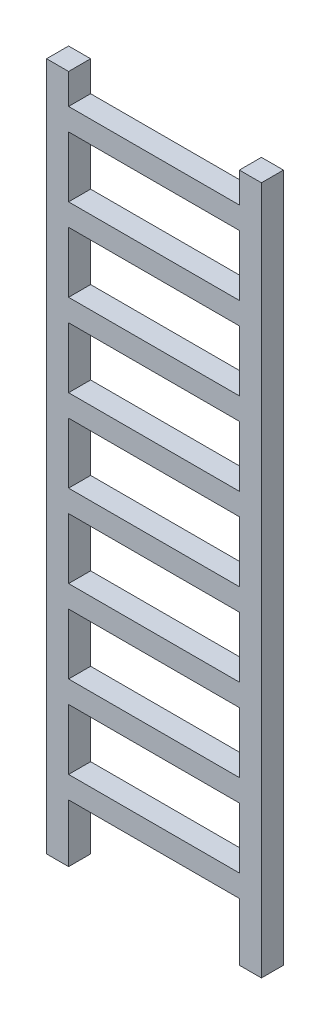
ISO-10303-21;
HEADER;
FILE_DESCRIPTION(('STEP AP214'),'2;1');
FILE_NAME('part.step','',(''),(''),'','','');
FILE_SCHEMA(('AUTOMOTIVE_DESIGN { 1 0 10303 214 1 1 1 1 }'));
ENDSEC;
DATA;
#1=APPLICATION_CONTEXT('core data for automotive mechanical design processes');
#2=APPLICATION_PROTOCOL_DEFINITION('international standard','automotive_design',2000,#1);
#3=PRODUCT_CONTEXT('',#1,'mechanical');
#4=PRODUCT('Part','Part','',(#3));
#5=PRODUCT_RELATED_PRODUCT_CATEGORY('part','',(#4));
#6=PRODUCT_DEFINITION_FORMATION('','',#4);
#7=PRODUCT_DEFINITION_CONTEXT('part definition',#1,'design');
#8=PRODUCT_DEFINITION('design','',#6,#7);
#9=PRODUCT_DEFINITION_SHAPE('','',#8);
#10=(LENGTH_UNIT() NAMED_UNIT(*) SI_UNIT(.MILLI.,.METRE.));
#11=(NAMED_UNIT(*) PLANE_ANGLE_UNIT() SI_UNIT($,.RADIAN.));
#12=(NAMED_UNIT(*) SI_UNIT($,.STERADIAN.) SOLID_ANGLE_UNIT());
#13=UNCERTAINTY_MEASURE_WITH_UNIT(LENGTH_MEASURE(1.E-05),#10,'distance_accuracy_value','');
#14=(GEOMETRIC_REPRESENTATION_CONTEXT(3) GLOBAL_UNCERTAINTY_ASSIGNED_CONTEXT((#13)) GLOBAL_UNIT_ASSIGNED_CONTEXT((#10,
#11,#12)) REPRESENTATION_CONTEXT('',''));
#15=CARTESIAN_POINT('',(0.,0.,0.));
#16=DIRECTION('',(0.,0.,1.));
#17=DIRECTION('',(1.,0.,0.));
#18=AXIS2_PLACEMENT_3D('',#15,#16,#17);
#19=CARTESIAN_POINT('',(-310.,-1250.,80.));
#20=DIRECTION('',(-1.,0.,0.));
#21=DIRECTION('',(0.,0.,1.));
#22=AXIS2_PLACEMENT_3D('',#19,#20,#21);
#23=PLANE('',#22);
#24=DIRECTION('',(0.,0.,1.));
#25=VECTOR('',#24,1.);
#26=CARTESIAN_POINT('',(-310.,-960.,80.));
#27=LINE('',#26,#25);
#28=CARTESIAN_POINT('',(-310.,-960.,0.));
#29=VERTEX_POINT('',#28);
#30=CARTESIAN_POINT('',(-310.,-960.,80.));
#31=VERTEX_POINT('',#30);
#32=EDGE_CURVE('E333',#29,#31,#27,.T.);
#33=ORIENTED_EDGE('',*,*,#32,.F.);
#34=DIRECTION('',(0.,1.,0.));
#35=VECTOR('',#34,1.);
#36=CARTESIAN_POINT('',(-310.,-1250.,0.));
#37=LINE('',#36,#35);
#38=CARTESIAN_POINT('',(-310.,-740.,0.));
#39=VERTEX_POINT('',#38);
#40=EDGE_CURVE('E537',#29,#39,#37,.T.);
#41=ORIENTED_EDGE('',*,*,#40,.T.);
#42=DIRECTION('',(0.,0.,-1.));
#43=VECTOR('',#42,1.);
#44=CARTESIAN_POINT('',(-310.,-740.,80.));
#45=LINE('',#44,#43);
#46=CARTESIAN_POINT('',(-310.,-740.,80.));
#47=VERTEX_POINT('',#46);
#48=EDGE_CURVE('E351',#47,#39,#45,.T.);
#49=ORIENTED_EDGE('',*,*,#48,.F.);
#50=DIRECTION('',(0.,1.,0.));
#51=VECTOR('',#50,1.);
#52=CARTESIAN_POINT('',(-310.,-1250.,80.));
#53=LINE('',#52,#51);
#54=EDGE_CURVE('E526',#31,#47,#53,.T.);
#55=ORIENTED_EDGE('',*,*,#54,.F.);
#56=EDGE_LOOP('',(#33,#41,#49,#55));
#57=FACE_BOUND('',#56,.T.);
#58=ADVANCED_FACE('F41',(#57),#23,.F.);
#59=DIRECTION('',(0.,0.,-1.));
#60=VECTOR('',#59,1.);
#61=CARTESIAN_POINT('',(-310.,-1040.,80.));
#62=LINE('',#61,#60);
#63=CARTESIAN_POINT('',(-310.,-1040.,80.));
#64=VERTEX_POINT('',#63);
#65=CARTESIAN_POINT('',(-310.,-1040.,0.));
#66=VERTEX_POINT('',#65);
#67=EDGE_CURVE('E317',#64,#66,#62,.T.);
#68=ORIENTED_EDGE('',*,*,#67,.F.);
#69=CARTESIAN_POINT('',(-310.,-1250.,80.));
#70=VERTEX_POINT('',#69);
#71=EDGE_CURVE('E522',#70,#64,#53,.T.);
#72=ORIENTED_EDGE('',*,*,#71,.F.);
#73=DIRECTION('',(0.,0.,-1.));
#74=VECTOR('',#73,1.);
#75=CARTESIAN_POINT('',(-310.,-1250.,80.));
#76=LINE('',#75,#74);
#77=CARTESIAN_POINT('',(-310.,-1250.,0.));
#78=VERTEX_POINT('',#77);
#79=EDGE_CURVE('E533',#70,#78,#76,.T.);
#80=ORIENTED_EDGE('',*,*,#79,.T.);
#81=EDGE_CURVE('E534',#78,#66,#37,.T.);
#82=ORIENTED_EDGE('',*,*,#81,.T.);
#83=EDGE_LOOP('',(#68,#72,#80,#82));
#84=FACE_BOUND('',#83,.T.);
#85=ADVANCED_FACE('F724',(#84),#23,.F.);
#86=CARTESIAN_POINT('',(310.,-1250.,80.));
#87=DIRECTION('',(1.,0.,0.));
#88=DIRECTION('',(0.,0.,-1.));
#89=AXIS2_PLACEMENT_3D('',#86,#87,#88);
#90=PLANE('',#89);
#91=DIRECTION('',(0.,0.,-1.));
#92=VECTOR('',#91,1.);
#93=CARTESIAN_POINT('',(310.,-960.,80.));
#94=LINE('',#93,#92);
#95=CARTESIAN_POINT('',(310.,-960.,80.));
#96=VERTEX_POINT('',#95);
#97=CARTESIAN_POINT('',(310.,-960.,0.));
#98=VERTEX_POINT('',#97);
#99=EDGE_CURVE('E64',#96,#98,#94,.T.);
#100=ORIENTED_EDGE('',*,*,#99,.F.);
#101=DIRECTION('',(0.,-1.,0.));
#102=VECTOR('',#101,1.);
#103=CARTESIAN_POINT('',(310.,-1250.,80.));
#104=LINE('',#103,#102);
#105=CARTESIAN_POINT('',(310.,-740.,80.));
#106=VERTEX_POINT('',#105);
#107=EDGE_CURVE('E607',#106,#96,#104,.T.);
#108=ORIENTED_EDGE('',*,*,#107,.F.);
#109=DIRECTION('',(0.,0.,1.));
#110=VECTOR('',#109,1.);
#111=CARTESIAN_POINT('',(310.,-740.,80.));
#112=LINE('',#111,#110);
#113=CARTESIAN_POINT('',(310.,-740.,0.));
#114=VERTEX_POINT('',#113);
#115=EDGE_CURVE('E344',#114,#106,#112,.T.);
#116=ORIENTED_EDGE('',*,*,#115,.F.);
#117=DIRECTION('',(0.,-1.,0.));
#118=VECTOR('',#117,1.);
#119=CARTESIAN_POINT('',(310.,-1250.,0.));
#120=LINE('',#119,#118);
#121=EDGE_CURVE('E308',#114,#98,#120,.T.);
#122=ORIENTED_EDGE('',*,*,#121,.T.);
#123=EDGE_LOOP('',(#100,#108,#116,#122));
#124=FACE_BOUND('',#123,.T.);
#125=ADVANCED_FACE('F594',(#124),#90,.F.);
#126=DIRECTION('',(0.,0.,1.));
#127=VECTOR('',#126,1.);
#128=CARTESIAN_POINT('',(310.,-1040.,80.));
#129=LINE('',#128,#127);
#130=CARTESIAN_POINT('',(310.,-1040.,0.));
#131=VERTEX_POINT('',#130);
#132=CARTESIAN_POINT('',(310.,-1040.,80.));
#133=VERTEX_POINT('',#132);
#134=EDGE_CURVE('E312',#131,#133,#129,.T.);
#135=ORIENTED_EDGE('',*,*,#134,.F.);
#136=CARTESIAN_POINT('',(310.,-1250.,0.));
#137=VERTEX_POINT('',#136);
#138=EDGE_CURVE('E299',#131,#137,#120,.T.);
#139=ORIENTED_EDGE('',*,*,#138,.T.);
#140=DIRECTION('',(0.,0.,-1.));
#141=VECTOR('',#140,1.);
#142=CARTESIAN_POINT('',(310.,-1250.,80.));
#143=LINE('',#142,#141);
#144=CARTESIAN_POINT('',(310.,-1250.,80.));
#145=VERTEX_POINT('',#144);
#146=EDGE_CURVE('E495',#145,#137,#143,.T.);
#147=ORIENTED_EDGE('',*,*,#146,.F.);
#148=EDGE_CURVE('E56',#133,#145,#104,.T.);
#149=ORIENTED_EDGE('',*,*,#148,.F.);
#150=EDGE_LOOP('',(#135,#139,#147,#149));
#151=FACE_BOUND('',#150,.T.);
#152=ADVANCED_FACE('F313',(#151),#90,.F.);
#153=DIRECTION('',(0.,0.,1.));
#154=VECTOR('',#153,1.);
#155=CARTESIAN_POINT('',(-310.,-660.,80.));
#156=LINE('',#155,#154);
#157=CARTESIAN_POINT('',(-310.,-660.,0.));
#158=VERTEX_POINT('',#157);
#159=CARTESIAN_POINT('',(-310.,-660.,80.));
#160=VERTEX_POINT('',#159);
#161=EDGE_CURVE('E357',#158,#160,#156,.T.);
#162=ORIENTED_EDGE('',*,*,#161,.F.);
#163=CARTESIAN_POINT('',(-310.,-440.,0.));
#164=VERTEX_POINT('',#163);
#165=EDGE_CURVE('E604',#158,#164,#37,.T.);
#166=ORIENTED_EDGE('',*,*,#165,.T.);
#167=DIRECTION('',(0.,0.,-1.));
#168=VECTOR('',#167,1.);
#169=CARTESIAN_POINT('',(-310.,-440.,80.));
#170=LINE('',#169,#168);
#171=CARTESIAN_POINT('',(-310.,-440.,80.));
#172=VERTEX_POINT('',#171);
#173=EDGE_CURVE('E375',#172,#164,#170,.T.);
#174=ORIENTED_EDGE('',*,*,#173,.F.);
#175=EDGE_CURVE('E678',#160,#172,#53,.T.);
#176=ORIENTED_EDGE('',*,*,#175,.F.);
#177=EDGE_LOOP('',(#162,#166,#174,#176));
#178=FACE_BOUND('',#177,.T.);
#179=ADVANCED_FACE('F701',(#178),#23,.F.);
#180=DIRECTION('',(0.,0.,-1.));
#181=VECTOR('',#180,1.);
#182=CARTESIAN_POINT('',(310.,-660.,80.));
#183=LINE('',#182,#181);
#184=CARTESIAN_POINT('',(310.,-660.,80.));
#185=VERTEX_POINT('',#184);
#186=CARTESIAN_POINT('',(310.,-660.,0.));
#187=VERTEX_POINT('',#186);
#188=EDGE_CURVE('E354',#185,#187,#183,.T.);
#189=ORIENTED_EDGE('',*,*,#188,.F.);
#190=CARTESIAN_POINT('',(310.,-440.,80.));
#191=VERTEX_POINT('',#190);
#192=EDGE_CURVE('E609',#191,#185,#104,.T.);
#193=ORIENTED_EDGE('',*,*,#192,.F.);
#194=DIRECTION('',(0.,0.,1.));
#195=VECTOR('',#194,1.);
#196=CARTESIAN_POINT('',(310.,-440.,80.));
#197=LINE('',#196,#195);
#198=CARTESIAN_POINT('',(310.,-440.,0.));
#199=VERTEX_POINT('',#198);
#200=EDGE_CURVE('E368',#199,#191,#197,.T.);
#201=ORIENTED_EDGE('',*,*,#200,.F.);
#202=EDGE_CURVE('E588',#199,#187,#120,.T.);
#203=ORIENTED_EDGE('',*,*,#202,.T.);
#204=EDGE_LOOP('',(#189,#193,#201,#203));
#205=FACE_BOUND('',#204,.T.);
#206=ADVANCED_FACE('F708',(#205),#90,.F.);
#207=DIRECTION('',(0.,0.,1.));
#208=VECTOR('',#207,1.);
#209=CARTESIAN_POINT('',(-310.,-360.,80.));
#210=LINE('',#209,#208);
#211=CARTESIAN_POINT('',(-310.,-360.,0.));
#212=VERTEX_POINT('',#211);
#213=CARTESIAN_POINT('',(-310.,-360.,80.));
#214=VERTEX_POINT('',#213);
#215=EDGE_CURVE('E381',#212,#214,#210,.T.);
#216=ORIENTED_EDGE('',*,*,#215,.F.);
#217=CARTESIAN_POINT('',(-310.,-140.,0.));
#218=VERTEX_POINT('',#217);
#219=EDGE_CURVE('E676',#212,#218,#37,.T.);
#220=ORIENTED_EDGE('',*,*,#219,.T.);
#221=DIRECTION('',(0.,0.,-1.));
#222=VECTOR('',#221,1.);
#223=CARTESIAN_POINT('',(-310.,-140.,80.));
#224=LINE('',#223,#222);
#225=CARTESIAN_POINT('',(-310.,-140.,80.));
#226=VERTEX_POINT('',#225);
#227=EDGE_CURVE('E399',#226,#218,#224,.T.);
#228=ORIENTED_EDGE('',*,*,#227,.F.);
#229=EDGE_CURVE('E677',#214,#226,#53,.T.);
#230=ORIENTED_EDGE('',*,*,#229,.F.);
#231=EDGE_LOOP('',(#216,#220,#228,#230));
#232=FACE_BOUND('',#231,.T.);
#233=ADVANCED_FACE('F674',(#232),#23,.F.);
#234=DIRECTION('',(0.,0.,-1.));
#235=VECTOR('',#234,1.);
#236=CARTESIAN_POINT('',(310.,-360.,80.));
#237=LINE('',#236,#235);
#238=CARTESIAN_POINT('',(310.,-360.,80.));
#239=VERTEX_POINT('',#238);
#240=CARTESIAN_POINT('',(310.,-360.,0.));
#241=VERTEX_POINT('',#240);
#242=EDGE_CURVE('E378',#239,#241,#237,.T.);
#243=ORIENTED_EDGE('',*,*,#242,.F.);
#244=CARTESIAN_POINT('',(310.,-140.,80.));
#245=VERTEX_POINT('',#244);
#246=EDGE_CURVE('E611',#245,#239,#104,.T.);
#247=ORIENTED_EDGE('',*,*,#246,.F.);
#248=DIRECTION('',(0.,0.,1.));
#249=VECTOR('',#248,1.);
#250=CARTESIAN_POINT('',(310.,-140.,80.));
#251=LINE('',#250,#249);
#252=CARTESIAN_POINT('',(310.,-140.,0.));
#253=VERTEX_POINT('',#252);
#254=EDGE_CURVE('E392',#253,#245,#251,.T.);
#255=ORIENTED_EDGE('',*,*,#254,.F.);
#256=EDGE_CURVE('E585',#253,#241,#120,.T.);
#257=ORIENTED_EDGE('',*,*,#256,.T.);
#258=EDGE_LOOP('',(#243,#247,#255,#257));
#259=FACE_BOUND('',#258,.T.);
#260=ADVANCED_FACE('F759',(#259),#90,.F.);
#261=DIRECTION('',(0.,0.,1.));
#262=VECTOR('',#261,1.);
#263=CARTESIAN_POINT('',(-310.,-60.0000000000001,80.));
#264=LINE('',#263,#262);
#265=CARTESIAN_POINT('',(-310.,-60.,0.));
#266=VERTEX_POINT('',#265);
#267=CARTESIAN_POINT('',(-310.,-60.0000000000001,80.));
#268=VERTEX_POINT('',#267);
#269=EDGE_CURVE('E405',#266,#268,#264,.T.);
#270=ORIENTED_EDGE('',*,*,#269,.F.);
#271=CARTESIAN_POINT('',(-310.,160.,0.));
#272=VERTEX_POINT('',#271);
#273=EDGE_CURVE('E695',#266,#272,#37,.T.);
#274=ORIENTED_EDGE('',*,*,#273,.T.);
#275=DIRECTION('',(0.,0.,-1.));
#276=VECTOR('',#275,1.);
#277=CARTESIAN_POINT('',(-310.,160.,80.));
#278=LINE('',#277,#276);
#279=CARTESIAN_POINT('',(-310.,160.,80.));
#280=VERTEX_POINT('',#279);
#281=EDGE_CURVE('E423',#280,#272,#278,.T.);
#282=ORIENTED_EDGE('',*,*,#281,.F.);
#283=EDGE_CURVE('E679',#268,#280,#53,.T.);
#284=ORIENTED_EDGE('',*,*,#283,.F.);
#285=EDGE_LOOP('',(#270,#274,#282,#284));
#286=FACE_BOUND('',#285,.T.);
#287=ADVANCED_FACE('F754',(#286),#23,.F.);
#288=DIRECTION('',(0.,0.,-1.));
#289=VECTOR('',#288,1.);
#290=CARTESIAN_POINT('',(310.,-60.0000000000001,80.));
#291=LINE('',#290,#289);
#292=CARTESIAN_POINT('',(310.,-60.0000000000001,80.));
#293=VERTEX_POINT('',#292);
#294=CARTESIAN_POINT('',(310.,-60.0000000000001,0.));
#295=VERTEX_POINT('',#294);
#296=EDGE_CURVE('E402',#293,#295,#291,.T.);
#297=ORIENTED_EDGE('',*,*,#296,.F.);
#298=CARTESIAN_POINT('',(310.,160.,80.));
#299=VERTEX_POINT('',#298);
#300=EDGE_CURVE('E659',#299,#293,#104,.T.);
#301=ORIENTED_EDGE('',*,*,#300,.F.);
#302=DIRECTION('',(0.,0.,1.));
#303=VECTOR('',#302,1.);
#304=CARTESIAN_POINT('',(310.,160.,80.));
#305=LINE('',#304,#303);
#306=CARTESIAN_POINT('',(310.,160.,0.));
#307=VERTEX_POINT('',#306);
#308=EDGE_CURVE('E416',#307,#299,#305,.T.);
#309=ORIENTED_EDGE('',*,*,#308,.F.);
#310=EDGE_CURVE('E582',#307,#295,#120,.T.);
#311=ORIENTED_EDGE('',*,*,#310,.T.);
#312=EDGE_LOOP('',(#297,#301,#309,#311));
#313=FACE_BOUND('',#312,.T.);
#314=ADVANCED_FACE('F752',(#313),#90,.F.);
#315=DIRECTION('',(0.,0.,1.));
#316=VECTOR('',#315,1.);
#317=CARTESIAN_POINT('',(-310.,240.,80.));
#318=LINE('',#317,#316);
#319=CARTESIAN_POINT('',(-310.,240.,0.));
#320=VERTEX_POINT('',#319);
#321=CARTESIAN_POINT('',(-310.,240.,80.));
#322=VERTEX_POINT('',#321);
#323=EDGE_CURVE('E429',#320,#322,#318,.T.);
#324=ORIENTED_EDGE('',*,*,#323,.F.);
#325=CARTESIAN_POINT('',(-310.,460.,0.));
#326=VERTEX_POINT('',#325);
#327=EDGE_CURVE('E686',#320,#326,#37,.T.);
#328=ORIENTED_EDGE('',*,*,#327,.T.);
#329=DIRECTION('',(0.,0.,-1.));
#330=VECTOR('',#329,1.);
#331=CARTESIAN_POINT('',(-310.,460.,80.));
#332=LINE('',#331,#330);
#333=CARTESIAN_POINT('',(-310.,460.,80.));
#334=VERTEX_POINT('',#333);
#335=EDGE_CURVE('E447',#334,#326,#332,.T.);
#336=ORIENTED_EDGE('',*,*,#335,.F.);
#337=EDGE_CURVE('E573',#322,#334,#53,.T.);
#338=ORIENTED_EDGE('',*,*,#337,.F.);
#339=EDGE_LOOP('',(#324,#328,#336,#338));
#340=FACE_BOUND('',#339,.T.);
#341=ADVANCED_FACE('F685',(#340),#23,.F.);
#342=DIRECTION('',(0.,0.,-1.));
#343=VECTOR('',#342,1.);
#344=CARTESIAN_POINT('',(310.,240.,80.));
#345=LINE('',#344,#343);
#346=CARTESIAN_POINT('',(310.,240.,80.));
#347=VERTEX_POINT('',#346);
#348=CARTESIAN_POINT('',(310.,240.,0.));
#349=VERTEX_POINT('',#348);
#350=EDGE_CURVE('E426',#347,#349,#345,.T.);
#351=ORIENTED_EDGE('',*,*,#350,.F.);
#352=CARTESIAN_POINT('',(310.,460.,80.));
#353=VERTEX_POINT('',#352);
#354=EDGE_CURVE('E657',#353,#347,#104,.T.);
#355=ORIENTED_EDGE('',*,*,#354,.F.);
#356=DIRECTION('',(0.,0.,1.));
#357=VECTOR('',#356,1.);
#358=CARTESIAN_POINT('',(310.,460.,80.));
#359=LINE('',#358,#357);
#360=CARTESIAN_POINT('',(310.,460.,0.));
#361=VERTEX_POINT('',#360);
#362=EDGE_CURVE('E440',#361,#353,#359,.T.);
#363=ORIENTED_EDGE('',*,*,#362,.F.);
#364=EDGE_CURVE('E581',#361,#349,#120,.T.);
#365=ORIENTED_EDGE('',*,*,#364,.T.);
#366=EDGE_LOOP('',(#351,#355,#363,#365));
#367=FACE_BOUND('',#366,.T.);
#368=ADVANCED_FACE('F690',(#367),#90,.F.);
#369=DIRECTION('',(0.,0.,1.));
#370=VECTOR('',#369,1.);
#371=CARTESIAN_POINT('',(-310.,540.,80.));
#372=LINE('',#371,#370);
#373=CARTESIAN_POINT('',(-310.,540.,0.));
#374=VERTEX_POINT('',#373);
#375=CARTESIAN_POINT('',(-310.,540.,80.));
#376=VERTEX_POINT('',#375);
#377=EDGE_CURVE('E453',#374,#376,#372,.T.);
#378=ORIENTED_EDGE('',*,*,#377,.F.);
#379=CARTESIAN_POINT('',(-310.,760.,0.));
#380=VERTEX_POINT('',#379);
#381=EDGE_CURVE('E576',#374,#380,#37,.T.);
#382=ORIENTED_EDGE('',*,*,#381,.T.);
#383=DIRECTION('',(0.,0.,-1.));
#384=VECTOR('',#383,1.);
#385=CARTESIAN_POINT('',(-310.,760.,80.));
#386=LINE('',#385,#384);
#387=CARTESIAN_POINT('',(-310.,760.,80.));
#388=VERTEX_POINT('',#387);
#389=EDGE_CURVE('E464',#388,#380,#386,.T.);
#390=ORIENTED_EDGE('',*,*,#389,.F.);
#391=EDGE_CURVE('E569',#376,#388,#53,.T.);
#392=ORIENTED_EDGE('',*,*,#391,.F.);
#393=EDGE_LOOP('',(#378,#382,#390,#392));
#394=FACE_BOUND('',#393,.T.);
#395=ADVANCED_FACE('F575',(#394),#23,.F.);
#396=DIRECTION('',(0.,0.,-1.));
#397=VECTOR('',#396,1.);
#398=CARTESIAN_POINT('',(310.,540.,80.));
#399=LINE('',#398,#397);
#400=CARTESIAN_POINT('',(310.,540.,80.));
#401=VERTEX_POINT('',#400);
#402=CARTESIAN_POINT('',(310.,540.,0.));
#403=VERTEX_POINT('',#402);
#404=EDGE_CURVE('E450',#401,#403,#399,.T.);
#405=ORIENTED_EDGE('',*,*,#404,.F.);
#406=CARTESIAN_POINT('',(310.,760.,80.));
#407=VERTEX_POINT('',#406);
#408=EDGE_CURVE('E567',#407,#401,#104,.T.);
#409=ORIENTED_EDGE('',*,*,#408,.F.);
#410=DIRECTION('',(0.,0.,1.));
#411=VECTOR('',#410,1.);
#412=CARTESIAN_POINT('',(310.,760.,80.));
#413=LINE('',#412,#411);
#414=CARTESIAN_POINT('',(310.,760.,0.));
#415=VERTEX_POINT('',#414);
#416=EDGE_CURVE('E49',#415,#407,#413,.T.);
#417=ORIENTED_EDGE('',*,*,#416,.F.);
#418=EDGE_CURVE('E580',#415,#403,#120,.T.);
#419=ORIENTED_EDGE('',*,*,#418,.T.);
#420=EDGE_LOOP('',(#405,#409,#417,#419));
#421=FACE_BOUND('',#420,.T.);
#422=ADVANCED_FACE('F740',(#421),#90,.F.);
#423=DIRECTION('',(0.,0.,1.));
#424=VECTOR('',#423,1.);
#425=CARTESIAN_POINT('',(-310.,840.,80.));
#426=LINE('',#425,#424);
#427=CARTESIAN_POINT('',(-310.,840.,0.));
#428=VERTEX_POINT('',#427);
#429=CARTESIAN_POINT('',(-310.,840.,80.));
#430=VERTEX_POINT('',#429);
#431=EDGE_CURVE('E471',#428,#430,#426,.T.);
#432=ORIENTED_EDGE('',*,*,#431,.F.);
#433=CARTESIAN_POINT('',(-310.,1060.,0.));
#434=VERTEX_POINT('',#433);
#435=EDGE_CURVE('E637',#428,#434,#37,.T.);
#436=ORIENTED_EDGE('',*,*,#435,.T.);
#437=DIRECTION('',(0.,0.,-1.));
#438=VECTOR('',#437,1.);
#439=CARTESIAN_POINT('',(-310.,1060.,80.));
#440=LINE('',#439,#438);
#441=CARTESIAN_POINT('',(-310.,1060.,80.));
#442=VERTEX_POINT('',#441);
#443=EDGE_CURVE('E513',#442,#434,#440,.T.);
#444=ORIENTED_EDGE('',*,*,#443,.F.);
#445=EDGE_CURVE('E574',#430,#442,#53,.T.);
#446=ORIENTED_EDGE('',*,*,#445,.F.);
#447=EDGE_LOOP('',(#432,#436,#444,#446));
#448=FACE_BOUND('',#447,.T.);
#449=ADVANCED_FACE('F647',(#448),#23,.F.);
#450=DIRECTION('',(0.,0.,-1.));
#451=VECTOR('',#450,1.);
#452=CARTESIAN_POINT('',(310.,840.,80.));
#453=LINE('',#452,#451);
#454=CARTESIAN_POINT('',(310.,840.,80.));
#455=VERTEX_POINT('',#454);
#456=CARTESIAN_POINT('',(310.,840.,0.));
#457=VERTEX_POINT('',#456);
#458=EDGE_CURVE('E11',#455,#457,#453,.T.);
#459=ORIENTED_EDGE('',*,*,#458,.F.);
#460=CARTESIAN_POINT('',(310.,1060.,80.));
#461=VERTEX_POINT('',#460);
#462=EDGE_CURVE('E484',#461,#455,#104,.T.);
#463=ORIENTED_EDGE('',*,*,#462,.F.);
#464=DIRECTION('',(0.,0.,-1.));
#465=VECTOR('',#464,1.);
#466=CARTESIAN_POINT('',(310.,1060.,80.));
#467=LINE('',#466,#465);
#468=CARTESIAN_POINT('',(310.,1060.,0.));
#469=VERTEX_POINT('',#468);
#470=EDGE_CURVE('E554',#461,#469,#467,.T.);
#471=ORIENTED_EDGE('',*,*,#470,.T.);
#472=EDGE_CURVE('E491',#469,#457,#120,.T.);
#473=ORIENTED_EDGE('',*,*,#472,.T.);
#474=EDGE_LOOP('',(#459,#463,#471,#473));
#475=FACE_BOUND('',#474,.T.);
#476=ADVANCED_FACE('F653',(#475),#90,.F.);
#477=CARTESIAN_POINT('',(-350.,1140.,80.));
#478=DIRECTION('',(0.,-1.,0.));
#479=DIRECTION('',(0.,0.,-1.));
#480=AXIS2_PLACEMENT_3D('',#477,#478,#479);
#481=PLANE('',#480);
#482=DIRECTION('',(0.,0.,1.));
#483=VECTOR('',#482,1.);
#484=CARTESIAN_POINT('',(310.,1140.,80.));
#485=LINE('',#484,#483);
#486=CARTESIAN_POINT('',(310.,1140.,0.));
#487=VERTEX_POINT('',#486);
#488=CARTESIAN_POINT('',(310.,1140.,80.));
#489=VERTEX_POINT('',#488);
#490=EDGE_CURVE('E503',#487,#489,#485,.T.);
#491=ORIENTED_EDGE('',*,*,#490,.F.);
#492=DIRECTION('',(-1.,0.,0.));
#493=VECTOR('',#492,1.);
#494=CARTESIAN_POINT('',(-350.,1140.,0.));
#495=LINE('',#494,#493);
#496=CARTESIAN_POINT('',(-310.,1140.,0.));
#497=VERTEX_POINT('',#496);
#498=EDGE_CURVE('E506',#487,#497,#495,.T.);
#499=ORIENTED_EDGE('',*,*,#498,.T.);
#500=DIRECTION('',(0.,0.,1.));
#501=VECTOR('',#500,1.);
#502=CARTESIAN_POINT('',(-310.,1140.,80.));
#503=LINE('',#502,#501);
#504=CARTESIAN_POINT('',(-310.,1140.,80.));
#505=VERTEX_POINT('',#504);
#506=EDGE_CURVE('E518',#497,#505,#503,.T.);
#507=ORIENTED_EDGE('',*,*,#506,.T.);
#508=DIRECTION('',(-1.,0.,0.));
#509=VECTOR('',#508,1.);
#510=CARTESIAN_POINT('',(-350.,1140.,80.));
#511=LINE('',#510,#509);
#512=EDGE_CURVE('E507',#489,#505,#511,.T.);
#513=ORIENTED_EDGE('',*,*,#512,.F.);
#514=EDGE_LOOP('',(#491,#499,#507,#513));
#515=FACE_BOUND('',#514,.T.);
#516=ADVANCED_FACE('F630',(#515),#481,.F.);
#517=CARTESIAN_POINT('',(-350.,1060.,80.));
#518=DIRECTION('',(0.,1.,0.));
#519=DIRECTION('',(0.,0.,1.));
#520=AXIS2_PLACEMENT_3D('',#517,#518,#519);
#521=PLANE('',#520);
#522=ORIENTED_EDGE('',*,*,#470,.F.);
#523=DIRECTION('',(1.,0.,0.));
#524=VECTOR('',#523,1.);
#525=CARTESIAN_POINT('',(-350.,1060.,80.));
#526=LINE('',#525,#524);
#527=EDGE_CURVE('E509',#442,#461,#526,.T.);
#528=ORIENTED_EDGE('',*,*,#527,.F.);
#529=ORIENTED_EDGE('',*,*,#443,.T.);
#530=DIRECTION('',(1.,0.,0.));
#531=VECTOR('',#530,1.);
#532=CARTESIAN_POINT('',(-350.,1060.,0.));
#533=LINE('',#532,#531);
#534=EDGE_CURVE('E510',#434,#469,#533,.T.);
#535=ORIENTED_EDGE('',*,*,#534,.T.);
#536=EDGE_LOOP('',(#522,#528,#529,#535));
#537=FACE_BOUND('',#536,.T.);
#538=ADVANCED_FACE('F650',(#537),#521,.F.);
#539=ORIENTED_EDGE('',*,*,#506,.F.);
#540=CARTESIAN_POINT('',(-310.,1250.,0.));
#541=VERTEX_POINT('',#540);
#542=EDGE_CURVE('E521',#497,#541,#37,.T.);
#543=ORIENTED_EDGE('',*,*,#542,.T.);
#544=DIRECTION('',(0.,0.,-1.));
#545=VECTOR('',#544,1.);
#546=CARTESIAN_POINT('',(-310.,1250.,80.));
#547=LINE('',#546,#545);
#548=CARTESIAN_POINT('',(-310.,1250.,80.));
#549=VERTEX_POINT('',#548);
#550=EDGE_CURVE('E551',#549,#541,#547,.T.);
#551=ORIENTED_EDGE('',*,*,#550,.F.);
#552=EDGE_CURVE('E527',#505,#549,#53,.T.);
#553=ORIENTED_EDGE('',*,*,#552,.F.);
#554=EDGE_LOOP('',(#539,#543,#551,#553));
#555=FACE_BOUND('',#554,.T.);
#556=ADVANCED_FACE('F43',(#555),#23,.F.);
#557=CARTESIAN_POINT('',(-390.,1250.,80.));
#558=DIRECTION('',(0.,-1.,0.));
#559=DIRECTION('',(0.,0.,-1.));
#560=AXIS2_PLACEMENT_3D('',#557,#558,#559);
#561=PLANE('',#560);
#562=DIRECTION('',(-1.,0.,0.));
#563=VECTOR('',#562,1.);
#564=CARTESIAN_POINT('',(-390.,1250.,0.));
#565=LINE('',#564,#563);
#566=CARTESIAN_POINT('',(-390.,1250.,0.));
#567=VERTEX_POINT('',#566);
#568=EDGE_CURVE('E536',#541,#567,#565,.T.);
#569=ORIENTED_EDGE('',*,*,#568,.T.);
#570=DIRECTION('',(0.,0.,-1.));
#571=VECTOR('',#570,1.);
#572=CARTESIAN_POINT('',(-390.,1250.,80.));
#573=LINE('',#572,#571);
#574=CARTESIAN_POINT('',(-390.,1250.,80.));
#575=VERTEX_POINT('',#574);
#576=EDGE_CURVE('E548',#575,#567,#573,.T.);
#577=ORIENTED_EDGE('',*,*,#576,.F.);
#578=DIRECTION('',(-1.,0.,0.));
#579=VECTOR('',#578,1.);
#580=CARTESIAN_POINT('',(-390.,1250.,80.));
#581=LINE('',#580,#579);
#582=EDGE_CURVE('E525',#549,#575,#581,.T.);
#583=ORIENTED_EDGE('',*,*,#582,.F.);
#584=ORIENTED_EDGE('',*,*,#550,.T.);
#585=EDGE_LOOP('',(#569,#577,#583,#584));
#586=FACE_BOUND('',#585,.T.);
#587=ADVANCED_FACE('F730',(#586),#561,.F.);
#588=CARTESIAN_POINT('',(-390.,-1250.,80.));
#589=DIRECTION('',(1.,0.,0.));
#590=DIRECTION('',(0.,0.,-1.));
#591=AXIS2_PLACEMENT_3D('',#588,#589,#590);
#592=PLANE('',#591);
#593=DIRECTION('',(0.,-1.,0.));
#594=VECTOR('',#593,1.);
#595=CARTESIAN_POINT('',(-390.,-1250.,0.));
#596=LINE('',#595,#594);
#597=CARTESIAN_POINT('',(-390.,-1250.,0.));
#598=VERTEX_POINT('',#597);
#599=EDGE_CURVE('E539',#567,#598,#596,.T.);
#600=ORIENTED_EDGE('',*,*,#599,.T.);
#601=DIRECTION('',(0.,0.,-1.));
#602=VECTOR('',#601,1.);
#603=CARTESIAN_POINT('',(-390.,-1250.,80.));
#604=LINE('',#603,#602);
#605=CARTESIAN_POINT('',(-390.,-1250.,80.));
#606=VERTEX_POINT('',#605);
#607=EDGE_CURVE('E545',#606,#598,#604,.T.);
#608=ORIENTED_EDGE('',*,*,#607,.F.);
#609=DIRECTION('',(0.,-1.,0.));
#610=VECTOR('',#609,1.);
#611=CARTESIAN_POINT('',(-390.,-1250.,80.));
#612=LINE('',#611,#610);
#613=EDGE_CURVE('E529',#575,#606,#612,.T.);
#614=ORIENTED_EDGE('',*,*,#613,.F.);
#615=ORIENTED_EDGE('',*,*,#576,.T.);
#616=EDGE_LOOP('',(#600,#608,#614,#615));
#617=FACE_BOUND('',#616,.T.);
#618=ADVANCED_FACE('F736',(#617),#592,.F.);
#619=CARTESIAN_POINT('',(-390.,-1250.,80.));
#620=DIRECTION('',(0.,1.,0.));
#621=DIRECTION('',(0.,0.,1.));
#622=AXIS2_PLACEMENT_3D('',#619,#620,#621);
#623=PLANE('',#622);
#624=DIRECTION('',(1.,0.,0.));
#625=VECTOR('',#624,1.);
#626=CARTESIAN_POINT('',(-390.,-1250.,0.));
#627=LINE('',#626,#625);
#628=EDGE_CURVE('E541',#598,#78,#627,.T.);
#629=ORIENTED_EDGE('',*,*,#628,.T.);
#630=ORIENTED_EDGE('',*,*,#79,.F.);
#631=DIRECTION('',(1.,0.,0.));
#632=VECTOR('',#631,1.);
#633=CARTESIAN_POINT('',(-390.,-1250.,80.));
#634=LINE('',#633,#632);
#635=EDGE_CURVE('E531',#606,#70,#634,.T.);
#636=ORIENTED_EDGE('',*,*,#635,.F.);
#637=ORIENTED_EDGE('',*,*,#607,.T.);
#638=EDGE_LOOP('',(#629,#630,#636,#637));
#639=FACE_BOUND('',#638,.T.);
#640=ADVANCED_FACE('F787',(#639),#623,.F.);
#641=CARTESIAN_POINT('',(0.,0.,80.));
#642=DIRECTION('',(0.,0.,-1.));
#643=DIRECTION('',(-1.,0.,0.));
#644=AXIS2_PLACEMENT_3D('',#641,#642,#643);
#645=PLANE('',#644);
#646=DIRECTION('',(-1.,0.,0.));
#647=VECTOR('',#646,1.);
#648=CARTESIAN_POINT('',(-350.,-960.,80.));
#649=LINE('',#648,#647);
#650=EDGE_CURVE('E322',#96,#31,#649,.T.);
#651=ORIENTED_EDGE('',*,*,#650,.T.);
#652=ORIENTED_EDGE('',*,*,#54,.T.);
#653=DIRECTION('',(1.,0.,0.));
#654=VECTOR('',#653,1.);
#655=CARTESIAN_POINT('',(-350.,-740.,80.));
#656=LINE('',#655,#654);
#657=EDGE_CURVE('E340',#47,#106,#656,.T.);
#658=ORIENTED_EDGE('',*,*,#657,.T.);
#659=ORIENTED_EDGE('',*,*,#107,.T.);
#660=EDGE_LOOP('',(#651,#652,#658,#659));
#661=FACE_BOUND('',#660,.T.);
#662=ORIENTED_EDGE('',*,*,#71,.T.);
#663=DIRECTION('',(1.,0.,0.));
#664=VECTOR('',#663,1.);
#665=CARTESIAN_POINT('',(-350.,-1040.,80.));
#666=LINE('',#665,#664);
#667=EDGE_CURVE('E318',#64,#133,#666,.T.);
#668=ORIENTED_EDGE('',*,*,#667,.T.);
#669=ORIENTED_EDGE('',*,*,#148,.T.);
#670=DIRECTION('',(1.,0.,0.));
#671=VECTOR('',#670,1.);
#672=CARTESIAN_POINT('',(310.,-1250.,80.));
#673=LINE('',#672,#671);
#674=CARTESIAN_POINT('',(390.,-1250.,80.));
#675=VERTEX_POINT('',#674);
#676=EDGE_CURVE('E483',#145,#675,#673,.T.);
#677=ORIENTED_EDGE('',*,*,#676,.T.);
#678=DIRECTION('',(0.,1.,0.));
#679=VECTOR('',#678,1.);
#680=CARTESIAN_POINT('',(390.,-1250.,80.));
#681=LINE('',#680,#679);
#682=CARTESIAN_POINT('',(390.,1250.,80.));
#683=VERTEX_POINT('',#682);
#684=EDGE_CURVE('E475',#675,#683,#681,.T.);
#685=ORIENTED_EDGE('',*,*,#684,.T.);
#686=DIRECTION('',(-1.,0.,0.));
#687=VECTOR('',#686,1.);
#688=CARTESIAN_POINT('',(310.,1250.,80.));
#689=LINE('',#688,#687);
#690=CARTESIAN_POINT('',(310.,1250.,80.));
#691=VERTEX_POINT('',#690);
#692=EDGE_CURVE('E478',#683,#691,#689,.T.);
#693=ORIENTED_EDGE('',*,*,#692,.T.);
#694=EDGE_CURVE('E480',#691,#489,#104,.T.);
#695=ORIENTED_EDGE('',*,*,#694,.T.);
#696=ORIENTED_EDGE('',*,*,#512,.T.);
#697=ORIENTED_EDGE('',*,*,#552,.T.);
#698=ORIENTED_EDGE('',*,*,#582,.T.);
#699=ORIENTED_EDGE('',*,*,#613,.T.);
#700=ORIENTED_EDGE('',*,*,#635,.T.);
#701=EDGE_LOOP('',(#662,#668,#669,#677,#685,#693,#695,#696,#697,#698,#699,#700));
#702=FACE_BOUND('',#701,.T.);
#703=DIRECTION('',(-1.,0.,0.));
#704=VECTOR('',#703,1.);
#705=CARTESIAN_POINT('',(-350.,-660.,80.));
#706=LINE('',#705,#704);
#707=EDGE_CURVE('E337',#185,#160,#706,.T.);
#708=ORIENTED_EDGE('',*,*,#707,.T.);
#709=ORIENTED_EDGE('',*,*,#175,.T.);
#710=DIRECTION('',(1.,0.,0.));
#711=VECTOR('',#710,1.);
#712=CARTESIAN_POINT('',(-350.,-440.,80.));
#713=LINE('',#712,#711);
#714=EDGE_CURVE('E364',#172,#191,#713,.T.);
#715=ORIENTED_EDGE('',*,*,#714,.T.);
#716=ORIENTED_EDGE('',*,*,#192,.T.);
#717=EDGE_LOOP('',(#708,#709,#715,#716));
#718=FACE_BOUND('',#717,.T.);
#719=DIRECTION('',(-1.,0.,0.));
#720=VECTOR('',#719,1.);
#721=CARTESIAN_POINT('',(-350.,-360.,80.));
#722=LINE('',#721,#720);
#723=EDGE_CURVE('E361',#239,#214,#722,.T.);
#724=ORIENTED_EDGE('',*,*,#723,.T.);
#725=ORIENTED_EDGE('',*,*,#229,.T.);
#726=DIRECTION('',(1.,0.,0.));
#727=VECTOR('',#726,1.);
#728=CARTESIAN_POINT('',(-350.,-140.,80.));
#729=LINE('',#728,#727);
#730=EDGE_CURVE('E388',#226,#245,#729,.T.);
#731=ORIENTED_EDGE('',*,*,#730,.T.);
#732=ORIENTED_EDGE('',*,*,#246,.T.);
#733=EDGE_LOOP('',(#724,#725,#731,#732));
#734=FACE_BOUND('',#733,.T.);
#735=DIRECTION('',(-1.,0.,0.));
#736=VECTOR('',#735,1.);
#737=CARTESIAN_POINT('',(-350.,-60.,80.));
#738=LINE('',#737,#736);
#739=EDGE_CURVE('E385',#293,#268,#738,.T.);
#740=ORIENTED_EDGE('',*,*,#739,.T.);
#741=ORIENTED_EDGE('',*,*,#283,.T.);
#742=DIRECTION('',(1.,0.,0.));
#743=VECTOR('',#742,1.);
#744=CARTESIAN_POINT('',(-350.,160.,80.));
#745=LINE('',#744,#743);
#746=EDGE_CURVE('E412',#280,#299,#745,.T.);
#747=ORIENTED_EDGE('',*,*,#746,.T.);
#748=ORIENTED_EDGE('',*,*,#300,.T.);
#749=EDGE_LOOP('',(#740,#741,#747,#748));
#750=FACE_BOUND('',#749,.T.);
#751=DIRECTION('',(-1.,0.,0.));
#752=VECTOR('',#751,1.);
#753=CARTESIAN_POINT('',(-350.,240.,80.));
#754=LINE('',#753,#752);
#755=EDGE_CURVE('E409',#347,#322,#754,.T.);
#756=ORIENTED_EDGE('',*,*,#755,.T.);
#757=ORIENTED_EDGE('',*,*,#337,.T.);
#758=DIRECTION('',(1.,0.,0.));
#759=VECTOR('',#758,1.);
#760=CARTESIAN_POINT('',(-350.,460.,80.));
#761=LINE('',#760,#759);
#762=EDGE_CURVE('E436',#334,#353,#761,.T.);
#763=ORIENTED_EDGE('',*,*,#762,.T.);
#764=ORIENTED_EDGE('',*,*,#354,.T.);
#765=EDGE_LOOP('',(#756,#757,#763,#764));
#766=FACE_BOUND('',#765,.T.);
#767=DIRECTION('',(-1.,0.,0.));
#768=VECTOR('',#767,1.);
#769=CARTESIAN_POINT('',(-350.,540.,80.));
#770=LINE('',#769,#768);
#771=EDGE_CURVE('E433',#401,#376,#770,.T.);
#772=ORIENTED_EDGE('',*,*,#771,.T.);
#773=ORIENTED_EDGE('',*,*,#391,.T.);
#774=DIRECTION('',(1.,0.,0.));
#775=VECTOR('',#774,1.);
#776=CARTESIAN_POINT('',(-350.,760.,80.));
#777=LINE('',#776,#775);
#778=EDGE_CURVE('E460',#388,#407,#777,.T.);
#779=ORIENTED_EDGE('',*,*,#778,.T.);
#780=ORIENTED_EDGE('',*,*,#408,.T.);
#781=EDGE_LOOP('',(#772,#773,#779,#780));
#782=FACE_BOUND('',#781,.T.);
#783=ORIENTED_EDGE('',*,*,#462,.T.);
#784=DIRECTION('',(-1.,0.,0.));
#785=VECTOR('',#784,1.);
#786=CARTESIAN_POINT('',(-350.,840.,80.));
#787=LINE('',#786,#785);
#788=EDGE_CURVE('E457',#455,#430,#787,.T.);
#789=ORIENTED_EDGE('',*,*,#788,.T.);
#790=ORIENTED_EDGE('',*,*,#445,.T.);
#791=ORIENTED_EDGE('',*,*,#527,.T.);
#792=EDGE_LOOP('',(#783,#789,#790,#791));
#793=FACE_BOUND('',#792,.T.);
#794=ADVANCED_FACE('F565',(#661,#702,#718,#734,#750,#766,#782,#793),#645,.F.);
#795=CARTESIAN_POINT('',(0.,0.,0.));
#796=DIRECTION('',(0.,0.,-1.));
#797=DIRECTION('',(-1.,0.,0.));
#798=AXIS2_PLACEMENT_3D('',#795,#796,#797);
#799=PLANE('',#798);
#800=ORIENTED_EDGE('',*,*,#40,.F.);
#801=DIRECTION('',(-1.,0.,0.));
#802=VECTOR('',#801,1.);
#803=CARTESIAN_POINT('',(-350.,-960.,0.));
#804=LINE('',#803,#802);
#805=EDGE_CURVE('E323',#98,#29,#804,.T.);
#806=ORIENTED_EDGE('',*,*,#805,.F.);
#807=ORIENTED_EDGE('',*,*,#121,.F.);
#808=DIRECTION('',(1.,0.,0.));
#809=VECTOR('',#808,1.);
#810=CARTESIAN_POINT('',(-350.,-740.,0.));
#811=LINE('',#810,#809);
#812=EDGE_CURVE('E341',#39,#114,#811,.T.);
#813=ORIENTED_EDGE('',*,*,#812,.F.);
#814=EDGE_LOOP('',(#800,#806,#807,#813));
#815=FACE_BOUND('',#814,.T.);
#816=ORIENTED_EDGE('',*,*,#138,.F.);
#817=DIRECTION('',(1.,0.,0.));
#818=VECTOR('',#817,1.);
#819=CARTESIAN_POINT('',(-350.,-1040.,0.));
#820=LINE('',#819,#818);
#821=EDGE_CURVE('E304',#66,#131,#820,.T.);
#822=ORIENTED_EDGE('',*,*,#821,.F.);
#823=ORIENTED_EDGE('',*,*,#81,.F.);
#824=ORIENTED_EDGE('',*,*,#628,.F.);
#825=ORIENTED_EDGE('',*,*,#599,.F.);
#826=ORIENTED_EDGE('',*,*,#568,.F.);
#827=ORIENTED_EDGE('',*,*,#542,.F.);
#828=ORIENTED_EDGE('',*,*,#498,.F.);
#829=CARTESIAN_POINT('',(310.,1250.,0.));
#830=VERTEX_POINT('',#829);
#831=EDGE_CURVE('E311',#830,#487,#120,.T.);
#832=ORIENTED_EDGE('',*,*,#831,.F.);
#833=DIRECTION('',(-1.,0.,0.));
#834=VECTOR('',#833,1.);
#835=CARTESIAN_POINT('',(310.,1250.,0.));
#836=LINE('',#835,#834);
#837=CARTESIAN_POINT('',(390.,1250.,0.));
#838=VERTEX_POINT('',#837);
#839=EDGE_CURVE('E309',#838,#830,#836,.T.);
#840=ORIENTED_EDGE('',*,*,#839,.F.);
#841=DIRECTION('',(0.,1.,0.));
#842=VECTOR('',#841,1.);
#843=CARTESIAN_POINT('',(390.,-1250.,0.));
#844=LINE('',#843,#842);
#845=CARTESIAN_POINT('',(390.,-1250.,0.));
#846=VERTEX_POINT('',#845);
#847=EDGE_CURVE('E474',#846,#838,#844,.T.);
#848=ORIENTED_EDGE('',*,*,#847,.F.);
#849=DIRECTION('',(1.,0.,0.));
#850=VECTOR('',#849,1.);
#851=CARTESIAN_POINT('',(310.,-1250.,0.));
#852=LINE('',#851,#850);
#853=EDGE_CURVE('E306',#137,#846,#852,.T.);
#854=ORIENTED_EDGE('',*,*,#853,.F.);
#855=EDGE_LOOP('',(#816,#822,#823,#824,#825,#826,#827,#828,#832,#840,#848,#854));
#856=FACE_BOUND('',#855,.T.);
#857=ORIENTED_EDGE('',*,*,#165,.F.);
#858=DIRECTION('',(-1.,0.,0.));
#859=VECTOR('',#858,1.);
#860=CARTESIAN_POINT('',(-350.,-660.,0.));
#861=LINE('',#860,#859);
#862=EDGE_CURVE('E336',#187,#158,#861,.T.);
#863=ORIENTED_EDGE('',*,*,#862,.F.);
#864=ORIENTED_EDGE('',*,*,#202,.F.);
#865=DIRECTION('',(1.,0.,0.));
#866=VECTOR('',#865,1.);
#867=CARTESIAN_POINT('',(-350.,-440.,0.));
#868=LINE('',#867,#866);
#869=EDGE_CURVE('E365',#164,#199,#868,.T.);
#870=ORIENTED_EDGE('',*,*,#869,.F.);
#871=EDGE_LOOP('',(#857,#863,#864,#870));
#872=FACE_BOUND('',#871,.T.);
#873=ORIENTED_EDGE('',*,*,#219,.F.);
#874=DIRECTION('',(-1.,0.,0.));
#875=VECTOR('',#874,1.);
#876=CARTESIAN_POINT('',(-350.,-360.,0.));
#877=LINE('',#876,#875);
#878=EDGE_CURVE('E360',#241,#212,#877,.T.);
#879=ORIENTED_EDGE('',*,*,#878,.F.);
#880=ORIENTED_EDGE('',*,*,#256,.F.);
#881=DIRECTION('',(1.,0.,0.));
#882=VECTOR('',#881,1.);
#883=CARTESIAN_POINT('',(-350.,-140.,0.));
#884=LINE('',#883,#882);
#885=EDGE_CURVE('E389',#218,#253,#884,.T.);
#886=ORIENTED_EDGE('',*,*,#885,.F.);
#887=EDGE_LOOP('',(#873,#879,#880,#886));
#888=FACE_BOUND('',#887,.T.);
#889=ORIENTED_EDGE('',*,*,#273,.F.);
#890=DIRECTION('',(-1.,0.,0.));
#891=VECTOR('',#890,1.);
#892=CARTESIAN_POINT('',(-350.,-60.,0.));
#893=LINE('',#892,#891);
#894=EDGE_CURVE('E384',#295,#266,#893,.T.);
#895=ORIENTED_EDGE('',*,*,#894,.F.);
#896=ORIENTED_EDGE('',*,*,#310,.F.);
#897=DIRECTION('',(1.,0.,0.));
#898=VECTOR('',#897,1.);
#899=CARTESIAN_POINT('',(-350.,160.,0.));
#900=LINE('',#899,#898);
#901=EDGE_CURVE('E413',#272,#307,#900,.T.);
#902=ORIENTED_EDGE('',*,*,#901,.F.);
#903=EDGE_LOOP('',(#889,#895,#896,#902));
#904=FACE_BOUND('',#903,.T.);
#905=ORIENTED_EDGE('',*,*,#327,.F.);
#906=DIRECTION('',(-1.,0.,0.));
#907=VECTOR('',#906,1.);
#908=CARTESIAN_POINT('',(-350.,240.,0.));
#909=LINE('',#908,#907);
#910=EDGE_CURVE('E408',#349,#320,#909,.T.);
#911=ORIENTED_EDGE('',*,*,#910,.F.);
#912=ORIENTED_EDGE('',*,*,#364,.F.);
#913=DIRECTION('',(1.,0.,0.));
#914=VECTOR('',#913,1.);
#915=CARTESIAN_POINT('',(-350.,460.,0.));
#916=LINE('',#915,#914);
#917=EDGE_CURVE('E437',#326,#361,#916,.T.);
#918=ORIENTED_EDGE('',*,*,#917,.F.);
#919=EDGE_LOOP('',(#905,#911,#912,#918));
#920=FACE_BOUND('',#919,.T.);
#921=ORIENTED_EDGE('',*,*,#381,.F.);
#922=DIRECTION('',(-1.,0.,0.));
#923=VECTOR('',#922,1.);
#924=CARTESIAN_POINT('',(-350.,540.,0.));
#925=LINE('',#924,#923);
#926=EDGE_CURVE('E432',#403,#374,#925,.T.);
#927=ORIENTED_EDGE('',*,*,#926,.F.);
#928=ORIENTED_EDGE('',*,*,#418,.F.);
#929=DIRECTION('',(1.,0.,0.));
#930=VECTOR('',#929,1.);
#931=CARTESIAN_POINT('',(-350.,760.,0.));
#932=LINE('',#931,#930);
#933=EDGE_CURVE('E461',#380,#415,#932,.T.);
#934=ORIENTED_EDGE('',*,*,#933,.F.);
#935=EDGE_LOOP('',(#921,#927,#928,#934));
#936=FACE_BOUND('',#935,.T.);
#937=DIRECTION('',(-1.,0.,0.));
#938=VECTOR('',#937,1.);
#939=CARTESIAN_POINT('',(-350.,840.,0.));
#940=LINE('',#939,#938);
#941=EDGE_CURVE('E456',#457,#428,#940,.T.);
#942=ORIENTED_EDGE('',*,*,#941,.F.);
#943=ORIENTED_EDGE('',*,*,#472,.F.);
#944=ORIENTED_EDGE('',*,*,#534,.F.);
#945=ORIENTED_EDGE('',*,*,#435,.F.);
#946=EDGE_LOOP('',(#942,#943,#944,#945));
#947=FACE_BOUND('',#946,.T.);
#948=ADVANCED_FACE('F300',(#815,#856,#872,#888,#904,#920,#936,#947),#799,.T.);
#949=ORIENTED_EDGE('',*,*,#831,.T.);
#950=ORIENTED_EDGE('',*,*,#490,.T.);
#951=ORIENTED_EDGE('',*,*,#694,.F.);
#952=DIRECTION('',(0.,0.,-1.));
#953=VECTOR('',#952,1.);
#954=CARTESIAN_POINT('',(310.,1250.,80.));
#955=LINE('',#954,#953);
#956=EDGE_CURVE('E497',#691,#830,#955,.T.);
#957=ORIENTED_EDGE('',*,*,#956,.T.);
#958=EDGE_LOOP('',(#949,#950,#951,#957));
#959=FACE_BOUND('',#958,.T.);
#960=ADVANCED_FACE('F627',(#959),#90,.F.);
#961=CARTESIAN_POINT('',(390.,-1250.,80.));
#962=DIRECTION('',(-1.,0.,0.));
#963=DIRECTION('',(0.,0.,1.));
#964=AXIS2_PLACEMENT_3D('',#961,#962,#963);
#965=PLANE('',#964);
#966=ORIENTED_EDGE('',*,*,#847,.T.);
#967=DIRECTION('',(0.,0.,-1.));
#968=VECTOR('',#967,1.);
#969=CARTESIAN_POINT('',(390.,1250.,80.));
#970=LINE('',#969,#968);
#971=EDGE_CURVE('E500',#683,#838,#970,.T.);
#972=ORIENTED_EDGE('',*,*,#971,.F.);
#973=ORIENTED_EDGE('',*,*,#684,.F.);
#974=DIRECTION('',(0.,0.,-1.));
#975=VECTOR('',#974,1.);
#976=CARTESIAN_POINT('',(390.,-1250.,80.));
#977=LINE('',#976,#975);
#978=EDGE_CURVE('E486',#675,#846,#977,.T.);
#979=ORIENTED_EDGE('',*,*,#978,.T.);
#980=EDGE_LOOP('',(#966,#972,#973,#979));
#981=FACE_BOUND('',#980,.T.);
#982=ADVANCED_FACE('F620',(#981),#965,.F.);
#983=CARTESIAN_POINT('',(310.,1250.,80.));
#984=DIRECTION('',(0.,-1.,0.));
#985=DIRECTION('',(0.,0.,-1.));
#986=AXIS2_PLACEMENT_3D('',#983,#984,#985);
#987=PLANE('',#986);
#988=ORIENTED_EDGE('',*,*,#839,.T.);
#989=ORIENTED_EDGE('',*,*,#956,.F.);
#990=ORIENTED_EDGE('',*,*,#692,.F.);
#991=ORIENTED_EDGE('',*,*,#971,.T.);
#992=EDGE_LOOP('',(#988,#989,#990,#991));
#993=FACE_BOUND('',#992,.T.);
#994=ADVANCED_FACE('F624',(#993),#987,.F.);
#995=CARTESIAN_POINT('',(310.,-1250.,80.));
#996=DIRECTION('',(0.,1.,0.));
#997=DIRECTION('',(0.,0.,1.));
#998=AXIS2_PLACEMENT_3D('',#995,#996,#997);
#999=PLANE('',#998);
#1000=ORIENTED_EDGE('',*,*,#853,.T.);
#1001=ORIENTED_EDGE('',*,*,#978,.F.);
#1002=ORIENTED_EDGE('',*,*,#676,.F.);
#1003=ORIENTED_EDGE('',*,*,#146,.T.);
#1004=EDGE_LOOP('',(#1000,#1001,#1002,#1003));
#1005=FACE_BOUND('',#1004,.T.);
#1006=ADVANCED_FACE('F616',(#1005),#999,.F.);
#1007=CARTESIAN_POINT('',(-350.,840.,80.));
#1008=DIRECTION('',(0.,-1.,0.));
#1009=DIRECTION('',(0.,0.,-1.));
#1010=AXIS2_PLACEMENT_3D('',#1007,#1008,#1009);
#1011=PLANE('',#1010);
#1012=ORIENTED_EDGE('',*,*,#941,.T.);
#1013=ORIENTED_EDGE('',*,*,#431,.T.);
#1014=ORIENTED_EDGE('',*,*,#788,.F.);
#1015=ORIENTED_EDGE('',*,*,#458,.T.);
#1016=EDGE_LOOP('',(#1012,#1013,#1014,#1015));
#1017=FACE_BOUND('',#1016,.T.);
#1018=ADVANCED_FACE('F656',(#1017),#1011,.F.);
#1019=CARTESIAN_POINT('',(-350.,760.,80.));
#1020=DIRECTION('',(0.,1.,0.));
#1021=DIRECTION('',(0.,0.,1.));
#1022=AXIS2_PLACEMENT_3D('',#1019,#1020,#1021);
#1023=PLANE('',#1022);
#1024=ORIENTED_EDGE('',*,*,#778,.F.);
#1025=ORIENTED_EDGE('',*,*,#389,.T.);
#1026=ORIENTED_EDGE('',*,*,#933,.T.);
#1027=ORIENTED_EDGE('',*,*,#416,.T.);
#1028=EDGE_LOOP('',(#1024,#1025,#1026,#1027));
#1029=FACE_BOUND('',#1028,.T.);
#1030=ADVANCED_FACE('F560',(#1029),#1023,.F.);
#1031=CARTESIAN_POINT('',(-350.,540.,80.));
#1032=DIRECTION('',(0.,-1.,0.));
#1033=DIRECTION('',(0.,0.,-1.));
#1034=AXIS2_PLACEMENT_3D('',#1031,#1032,#1033);
#1035=PLANE('',#1034);
#1036=ORIENTED_EDGE('',*,*,#926,.T.);
#1037=ORIENTED_EDGE('',*,*,#377,.T.);
#1038=ORIENTED_EDGE('',*,*,#771,.F.);
#1039=ORIENTED_EDGE('',*,*,#404,.T.);
#1040=EDGE_LOOP('',(#1036,#1037,#1038,#1039));
#1041=FACE_BOUND('',#1040,.T.);
#1042=ADVANCED_FACE('F867',(#1041),#1035,.F.);
#1043=CARTESIAN_POINT('',(-350.,460.,80.));
#1044=DIRECTION('',(0.,1.,0.));
#1045=DIRECTION('',(0.,0.,1.));
#1046=AXIS2_PLACEMENT_3D('',#1043,#1044,#1045);
#1047=PLANE('',#1046);
#1048=ORIENTED_EDGE('',*,*,#762,.F.);
#1049=ORIENTED_EDGE('',*,*,#335,.T.);
#1050=ORIENTED_EDGE('',*,*,#917,.T.);
#1051=ORIENTED_EDGE('',*,*,#362,.T.);
#1052=EDGE_LOOP('',(#1048,#1049,#1050,#1051));
#1053=FACE_BOUND('',#1052,.T.);
#1054=ADVANCED_FACE('F689',(#1053),#1047,.F.);
#1055=CARTESIAN_POINT('',(-350.,240.,80.));
#1056=DIRECTION('',(0.,-1.,0.));
#1057=DIRECTION('',(0.,0.,-1.));
#1058=AXIS2_PLACEMENT_3D('',#1055,#1056,#1057);
#1059=PLANE('',#1058);
#1060=ORIENTED_EDGE('',*,*,#910,.T.);
#1061=ORIENTED_EDGE('',*,*,#323,.T.);
#1062=ORIENTED_EDGE('',*,*,#755,.F.);
#1063=ORIENTED_EDGE('',*,*,#350,.T.);
#1064=EDGE_LOOP('',(#1060,#1061,#1062,#1063));
#1065=FACE_BOUND('',#1064,.T.);
#1066=ADVANCED_FACE('F693',(#1065),#1059,.F.);
#1067=CARTESIAN_POINT('',(-350.,160.,80.));
#1068=DIRECTION('',(0.,1.,0.));
#1069=DIRECTION('',(0.,0.,1.));
#1070=AXIS2_PLACEMENT_3D('',#1067,#1068,#1069);
#1071=PLANE('',#1070);
#1072=ORIENTED_EDGE('',*,*,#746,.F.);
#1073=ORIENTED_EDGE('',*,*,#281,.T.);
#1074=ORIENTED_EDGE('',*,*,#901,.T.);
#1075=ORIENTED_EDGE('',*,*,#308,.T.);
#1076=EDGE_LOOP('',(#1072,#1073,#1074,#1075));
#1077=FACE_BOUND('',#1076,.T.);
#1078=ADVANCED_FACE('F909',(#1077),#1071,.F.);
#1079=CARTESIAN_POINT('',(-350.,-60.,80.));
#1080=DIRECTION('',(0.,-1.,0.));
#1081=DIRECTION('',(0.,0.,-1.));
#1082=AXIS2_PLACEMENT_3D('',#1079,#1080,#1081);
#1083=PLANE('',#1082);
#1084=ORIENTED_EDGE('',*,*,#894,.T.);
#1085=ORIENTED_EDGE('',*,*,#269,.T.);
#1086=ORIENTED_EDGE('',*,*,#739,.F.);
#1087=ORIENTED_EDGE('',*,*,#296,.T.);
#1088=EDGE_LOOP('',(#1084,#1085,#1086,#1087));
#1089=FACE_BOUND('',#1088,.T.);
#1090=ADVANCED_FACE('F917',(#1089),#1083,.F.);
#1091=CARTESIAN_POINT('',(-350.,-140.,80.));
#1092=DIRECTION('',(0.,1.,0.));
#1093=DIRECTION('',(0.,0.,1.));
#1094=AXIS2_PLACEMENT_3D('',#1091,#1092,#1093);
#1095=PLANE('',#1094);
#1096=ORIENTED_EDGE('',*,*,#730,.F.);
#1097=ORIENTED_EDGE('',*,*,#227,.T.);
#1098=ORIENTED_EDGE('',*,*,#885,.T.);
#1099=ORIENTED_EDGE('',*,*,#254,.T.);
#1100=EDGE_LOOP('',(#1096,#1097,#1098,#1099));
#1101=FACE_BOUND('',#1100,.T.);
#1102=ADVANCED_FACE('F936',(#1101),#1095,.F.);
#1103=CARTESIAN_POINT('',(-350.,-360.,80.));
#1104=DIRECTION('',(0.,-1.,0.));
#1105=DIRECTION('',(0.,0.,-1.));
#1106=AXIS2_PLACEMENT_3D('',#1103,#1104,#1105);
#1107=PLANE('',#1106);
#1108=ORIENTED_EDGE('',*,*,#878,.T.);
#1109=ORIENTED_EDGE('',*,*,#215,.T.);
#1110=ORIENTED_EDGE('',*,*,#723,.F.);
#1111=ORIENTED_EDGE('',*,*,#242,.T.);
#1112=EDGE_LOOP('',(#1108,#1109,#1110,#1111));
#1113=FACE_BOUND('',#1112,.T.);
#1114=ADVANCED_FACE('F670',(#1113),#1107,.F.);
#1115=CARTESIAN_POINT('',(-350.,-440.,80.));
#1116=DIRECTION('',(0.,1.,0.));
#1117=DIRECTION('',(0.,0.,1.));
#1118=AXIS2_PLACEMENT_3D('',#1115,#1116,#1117);
#1119=PLANE('',#1118);
#1120=ORIENTED_EDGE('',*,*,#714,.F.);
#1121=ORIENTED_EDGE('',*,*,#173,.T.);
#1122=ORIENTED_EDGE('',*,*,#869,.T.);
#1123=ORIENTED_EDGE('',*,*,#200,.T.);
#1124=EDGE_LOOP('',(#1120,#1121,#1122,#1123));
#1125=FACE_BOUND('',#1124,.T.);
#1126=ADVANCED_FACE('F706',(#1125),#1119,.F.);
#1127=CARTESIAN_POINT('',(-350.,-660.,80.));
#1128=DIRECTION('',(0.,-1.,0.));
#1129=DIRECTION('',(0.,0.,-1.));
#1130=AXIS2_PLACEMENT_3D('',#1127,#1128,#1129);
#1131=PLANE('',#1130);
#1132=ORIENTED_EDGE('',*,*,#862,.T.);
#1133=ORIENTED_EDGE('',*,*,#161,.T.);
#1134=ORIENTED_EDGE('',*,*,#707,.F.);
#1135=ORIENTED_EDGE('',*,*,#188,.T.);
#1136=EDGE_LOOP('',(#1132,#1133,#1134,#1135));
#1137=FACE_BOUND('',#1136,.T.);
#1138=ADVANCED_FACE('F711',(#1137),#1131,.F.);
#1139=CARTESIAN_POINT('',(-350.,-740.,80.));
#1140=DIRECTION('',(0.,1.,0.));
#1141=DIRECTION('',(0.,0.,1.));
#1142=AXIS2_PLACEMENT_3D('',#1139,#1140,#1141);
#1143=PLANE('',#1142);
#1144=ORIENTED_EDGE('',*,*,#657,.F.);
#1145=ORIENTED_EDGE('',*,*,#48,.T.);
#1146=ORIENTED_EDGE('',*,*,#812,.T.);
#1147=ORIENTED_EDGE('',*,*,#115,.T.);
#1148=EDGE_LOOP('',(#1144,#1145,#1146,#1147));
#1149=FACE_BOUND('',#1148,.T.);
#1150=ADVANCED_FACE('F713',(#1149),#1143,.F.);
#1151=CARTESIAN_POINT('',(-350.,-960.,80.));
#1152=DIRECTION('',(0.,-1.,0.));
#1153=DIRECTION('',(0.,0.,-1.));
#1154=AXIS2_PLACEMENT_3D('',#1151,#1152,#1153);
#1155=PLANE('',#1154);
#1156=ORIENTED_EDGE('',*,*,#805,.T.);
#1157=ORIENTED_EDGE('',*,*,#32,.T.);
#1158=ORIENTED_EDGE('',*,*,#650,.F.);
#1159=ORIENTED_EDGE('',*,*,#99,.T.);
#1160=EDGE_LOOP('',(#1156,#1157,#1158,#1159));
#1161=FACE_BOUND('',#1160,.T.);
#1162=ADVANCED_FACE('F600',(#1161),#1155,.F.);
#1163=CARTESIAN_POINT('',(-350.,-1040.,80.));
#1164=DIRECTION('',(0.,1.,0.));
#1165=DIRECTION('',(0.,0.,1.));
#1166=AXIS2_PLACEMENT_3D('',#1163,#1164,#1165);
#1167=PLANE('',#1166);
#1168=ORIENTED_EDGE('',*,*,#667,.F.);
#1169=ORIENTED_EDGE('',*,*,#67,.T.);
#1170=ORIENTED_EDGE('',*,*,#821,.T.);
#1171=ORIENTED_EDGE('',*,*,#134,.T.);
#1172=EDGE_LOOP('',(#1168,#1169,#1170,#1171));
#1173=FACE_BOUND('',#1172,.T.);
#1174=ADVANCED_FACE('F321',(#1173),#1167,.F.);
#1175=CLOSED_SHELL('',(#58,#85,#125,#152,#179,#206,#233,#260,#287,#314,#341,#368,#395,#422,#449,
#476,#516,#538,#556,#587,#618,#640,#794,#948,#960,#982,#994,#1006,#1018,#1030,#1042,#1054,#1066,
#1078,#1090,#1102,#1114,#1126,#1138,#1150,#1162,#1174));
#1176=MANIFOLD_SOLID_BREP('B2',#1175);
#1177=ADVANCED_BREP_SHAPE_REPRESENTATION('',(#18,#1176),#14);
#1178=SHAPE_DEFINITION_REPRESENTATION(#9,#1177);
ENDSEC;
END-ISO-10303-21;
